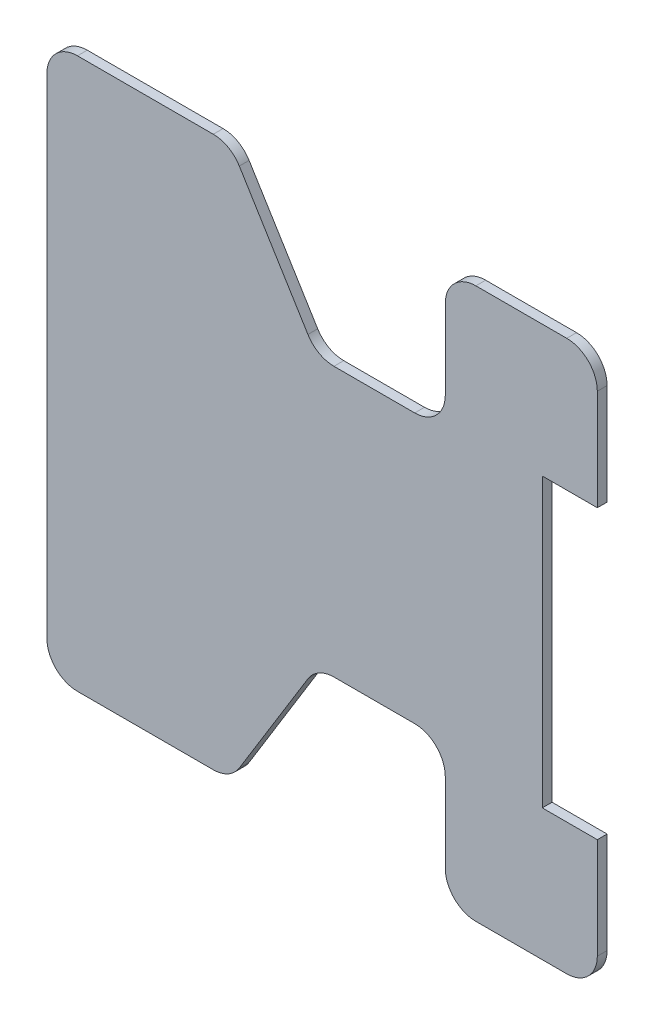
ISO-10303-21;
HEADER;
FILE_DESCRIPTION(('STEP AP214'),'2;1');
FILE_NAME('part.step','',(''),(''),'','','');
FILE_SCHEMA(('AUTOMOTIVE_DESIGN { 1 0 10303 214 1 1 1 1 }'));
ENDSEC;
DATA;
#1=APPLICATION_CONTEXT('core data for automotive mechanical design processes');
#2=APPLICATION_PROTOCOL_DEFINITION('international standard','automotive_design',2000,#1);
#3=PRODUCT_CONTEXT('',#1,'mechanical');
#4=PRODUCT('Part','Part','',(#3));
#5=PRODUCT_RELATED_PRODUCT_CATEGORY('part','',(#4));
#6=PRODUCT_DEFINITION_FORMATION('','',#4);
#7=PRODUCT_DEFINITION_CONTEXT('part definition',#1,'design');
#8=PRODUCT_DEFINITION('design','',#6,#7);
#9=PRODUCT_DEFINITION_SHAPE('','',#8);
#10=(LENGTH_UNIT() NAMED_UNIT(*) SI_UNIT(.MILLI.,.METRE.));
#11=(NAMED_UNIT(*) PLANE_ANGLE_UNIT() SI_UNIT($,.RADIAN.));
#12=(NAMED_UNIT(*) SI_UNIT($,.STERADIAN.) SOLID_ANGLE_UNIT());
#13=UNCERTAINTY_MEASURE_WITH_UNIT(LENGTH_MEASURE(1.E-05),#10,'distance_accuracy_value','');
#14=(GEOMETRIC_REPRESENTATION_CONTEXT(3) GLOBAL_UNCERTAINTY_ASSIGNED_CONTEXT((#13)) GLOBAL_UNIT_ASSIGNED_CONTEXT((#10,
#11,#12)) REPRESENTATION_CONTEXT('',''));
#15=CARTESIAN_POINT('',(0.,0.,0.));
#16=DIRECTION('',(0.,0.,1.));
#17=DIRECTION('',(1.,0.,0.));
#18=AXIS2_PLACEMENT_3D('',#15,#16,#17);
#19=CARTESIAN_POINT('',(0.,0.,1.6));
#20=DIRECTION('',(0.,1.,0.));
#21=DIRECTION('',(0.,0.,1.));
#22=AXIS2_PLACEMENT_3D('',#19,#20,#21);
#23=PLANE('',#22);
#24=DIRECTION('',(1.,0.,0.));
#25=VECTOR('',#24,1.);
#26=CARTESIAN_POINT('',(0.,0.,0.));
#27=LINE('',#26,#25);
#28=CARTESIAN_POINT('',(70.142135623731,0.,0.));
#29=VERTEX_POINT('',#28);
#30=CARTESIAN_POINT('',(85.,0.,0.));
#31=VERTEX_POINT('',#30);
#32=EDGE_CURVE('E278',#29,#31,#27,.T.);
#33=ORIENTED_EDGE('',*,*,#32,.T.);
#34=DIRECTION('',(0.,0.,-1.));
#35=VECTOR('',#34,1.);
#36=CARTESIAN_POINT('',(85.,0.,1.6));
#37=LINE('',#36,#35);
#38=CARTESIAN_POINT('',(85.,0.,1.6));
#39=VERTEX_POINT('',#38);
#40=EDGE_CURVE('E412',#31,#39,#37,.F.);
#41=ORIENTED_EDGE('',*,*,#40,.T.);
#42=DIRECTION('',(1.,0.,0.));
#43=VECTOR('',#42,1.);
#44=CARTESIAN_POINT('',(0.,0.,1.6));
#45=LINE('',#44,#43);
#46=CARTESIAN_POINT('',(70.142135623731,0.,1.6));
#47=VERTEX_POINT('',#46);
#48=EDGE_CURVE('E490',#47,#39,#45,.T.);
#49=ORIENTED_EDGE('',*,*,#48,.F.);
#50=DIRECTION('',(0.,0.,1.));
#51=VECTOR('',#50,1.);
#52=CARTESIAN_POINT('',(70.142135623731,0.,0.));
#53=LINE('',#52,#51);
#54=EDGE_CURVE('E409',#47,#29,#53,.F.);
#55=ORIENTED_EDGE('',*,*,#54,.T.);
#56=EDGE_LOOP('',(#33,#41,#49,#55));
#57=FACE_BOUND('',#56,.T.);
#58=ADVANCED_FACE('F40',(#57),#23,.F.);
#59=CARTESIAN_POINT('',(5.,0.,1.6));
#60=VERTEX_POINT('',#59);
#61=CARTESIAN_POINT('',(27.2048120921154,0.,1.6));
#62=VERTEX_POINT('',#61);
#63=EDGE_CURVE('E238',#60,#62,#45,.T.);
#64=ORIENTED_EDGE('',*,*,#63,.F.);
#65=DIRECTION('',(0.,0.,-1.));
#66=VECTOR('',#65,1.);
#67=CARTESIAN_POINT('',(5.,0.,1.6));
#68=LINE('',#67,#66);
#69=CARTESIAN_POINT('',(5.,0.,0.));
#70=VERTEX_POINT('',#69);
#71=EDGE_CURVE('E377',#60,#70,#68,.T.);
#72=ORIENTED_EDGE('',*,*,#71,.T.);
#73=CARTESIAN_POINT('',(27.2048120921154,0.,0.));
#74=VERTEX_POINT('',#73);
#75=EDGE_CURVE('E280',#70,#74,#27,.T.);
#76=ORIENTED_EDGE('',*,*,#75,.T.);
#77=DIRECTION('',(0.,0.,1.));
#78=VECTOR('',#77,1.);
#79=CARTESIAN_POINT('',(27.2048120921154,0.,1.6));
#80=LINE('',#79,#78);
#81=EDGE_CURVE('E373',#74,#62,#80,.T.);
#82=ORIENTED_EDGE('',*,*,#81,.T.);
#83=EDGE_LOOP('',(#64,#72,#76,#82));
#84=FACE_BOUND('',#83,.T.);
#85=ADVANCED_FACE('F486',(#84),#23,.F.);
#86=CARTESIAN_POINT('',(0.,90.,1.6));
#87=DIRECTION('',(0.,-1.,0.));
#88=DIRECTION('',(0.,0.,-1.));
#89=AXIS2_PLACEMENT_3D('',#86,#87,#88);
#90=PLANE('',#89);
#91=DIRECTION('',(-1.,0.,0.));
#92=VECTOR('',#91,1.);
#93=CARTESIAN_POINT('',(0.,90.,0.));
#94=LINE('',#93,#92);
#95=CARTESIAN_POINT('',(27.2048120921154,90.,0.));
#96=VERTEX_POINT('',#95);
#97=CARTESIAN_POINT('',(5.,90.,0.));
#98=VERTEX_POINT('',#97);
#99=EDGE_CURVE('E299',#96,#98,#94,.T.);
#100=ORIENTED_EDGE('',*,*,#99,.T.);
#101=DIRECTION('',(0.,0.,-1.));
#102=VECTOR('',#101,1.);
#103=CARTESIAN_POINT('',(5.,90.,1.6));
#104=LINE('',#103,#102);
#105=CARTESIAN_POINT('',(5.,90.,1.6));
#106=VERTEX_POINT('',#105);
#107=EDGE_CURVE('E347',#98,#106,#104,.F.);
#108=ORIENTED_EDGE('',*,*,#107,.T.);
#109=DIRECTION('',(-1.,0.,0.));
#110=VECTOR('',#109,1.);
#111=CARTESIAN_POINT('',(0.,90.,1.6));
#112=LINE('',#111,#110);
#113=CARTESIAN_POINT('',(27.2048120921154,90.,1.6));
#114=VERTEX_POINT('',#113);
#115=EDGE_CURVE('E268',#114,#106,#112,.T.);
#116=ORIENTED_EDGE('',*,*,#115,.F.);
#117=DIRECTION('',(0.,0.,1.));
#118=VECTOR('',#117,1.);
#119=CARTESIAN_POINT('',(27.2048120921154,90.,0.));
#120=LINE('',#119,#118);
#121=EDGE_CURVE('E344',#114,#96,#120,.F.);
#122=ORIENTED_EDGE('',*,*,#121,.T.);
#123=EDGE_LOOP('',(#100,#108,#116,#122));
#124=FACE_BOUND('',#123,.T.);
#125=ADVANCED_FACE('F622',(#124),#90,.F.);
#126=CARTESIAN_POINT('',(85.,90.,1.6));
#127=VERTEX_POINT('',#126);
#128=CARTESIAN_POINT('',(70.142135623731,90.,1.6));
#129=VERTEX_POINT('',#128);
#130=EDGE_CURVE('E269',#127,#129,#112,.T.);
#131=ORIENTED_EDGE('',*,*,#130,.F.);
#132=DIRECTION('',(0.,0.,-1.));
#133=VECTOR('',#132,1.);
#134=CARTESIAN_POINT('',(85.,90.,1.6));
#135=LINE('',#134,#133);
#136=CARTESIAN_POINT('',(85.,90.,0.));
#137=VERTEX_POINT('',#136);
#138=EDGE_CURVE('E399',#127,#137,#135,.T.);
#139=ORIENTED_EDGE('',*,*,#138,.T.);
#140=CARTESIAN_POINT('',(70.142135623731,90.,0.));
#141=VERTEX_POINT('',#140);
#142=EDGE_CURVE('E300',#137,#141,#94,.T.);
#143=ORIENTED_EDGE('',*,*,#142,.T.);
#144=DIRECTION('',(0.,0.,1.));
#145=VECTOR('',#144,1.);
#146=CARTESIAN_POINT('',(70.142135623731,90.,1.6));
#147=LINE('',#146,#145);
#148=EDGE_CURVE('E395',#141,#129,#147,.T.);
#149=ORIENTED_EDGE('',*,*,#148,.T.);
#150=EDGE_LOOP('',(#131,#139,#143,#149));
#151=FACE_BOUND('',#150,.T.);
#152=ADVANCED_FACE('F594',(#151),#90,.F.);
#153=CARTESIAN_POINT('',(0.,0.,1.6));
#154=DIRECTION('',(0.,0.,-1.));
#155=DIRECTION('',(-1.,0.,0.));
#156=AXIS2_PLACEMENT_3D('',#153,#154,#155);
#157=PLANE('',#156);
#158=ORIENTED_EDGE('',*,*,#115,.T.);
#159=CARTESIAN_POINT('',(5.,85.,1.6));
#160=DIRECTION('',(0.,0.,-1.));
#161=DIRECTION('',(-1.,0.,0.));
#162=AXIS2_PLACEMENT_3D('',#159,#160,#161);
#163=CIRCLE('',#162,5.);
#164=CARTESIAN_POINT('',(0.,85.,1.6));
#165=VERTEX_POINT('',#164);
#166=EDGE_CURVE('E370',#106,#165,#163,.F.);
#167=ORIENTED_EDGE('',*,*,#166,.T.);
#168=DIRECTION('',(0.,-1.,0.));
#169=VECTOR('',#168,1.);
#170=CARTESIAN_POINT('',(0.,0.,1.6));
#171=LINE('',#170,#169);
#172=CARTESIAN_POINT('',(0.,5.,1.6));
#173=VERTEX_POINT('',#172);
#174=EDGE_CURVE('E304',#165,#173,#171,.T.);
#175=ORIENTED_EDGE('',*,*,#174,.T.);
#176=CARTESIAN_POINT('',(5.,5.,1.6));
#177=DIRECTION('',(0.,0.,-1.));
#178=DIRECTION('',(-1.,0.,0.));
#179=AXIS2_PLACEMENT_3D('',#176,#177,#178);
#180=CIRCLE('',#179,5.);
#181=EDGE_CURVE('E367',#173,#60,#180,.F.);
#182=ORIENTED_EDGE('',*,*,#181,.T.);
#183=ORIENTED_EDGE('',*,*,#63,.T.);
#184=CARTESIAN_POINT('',(27.2048120921154,5.,1.6));
#185=DIRECTION('',(0.,0.,-1.));
#186=DIRECTION('',(-1.,0.,0.));
#187=AXIS2_PLACEMENT_3D('',#184,#185,#186);
#188=CIRCLE('',#187,5.);
#189=CARTESIAN_POINT('',(31.4640713513747,2.38108599560538,1.6));
#190=VERTEX_POINT('',#189);
#191=EDGE_CURVE('E364',#62,#190,#188,.F.);
#192=ORIENTED_EDGE('',*,*,#191,.T.);
#193=DIRECTION('',(0.523782800878925,0.851851851851851,0.));
#194=VECTOR('',#193,1.);
#195=CARTESIAN_POINT('',(44.142135623731,23.,1.6));
#196=LINE('',#195,#194);
#197=CARTESIAN_POINT('',(42.6780642723563,20.6189140043946,1.6));
#198=VERTEX_POINT('',#197);
#199=EDGE_CURVE('E513',#190,#198,#196,.T.);
#200=ORIENTED_EDGE('',*,*,#199,.T.);
#201=CARTESIAN_POINT('',(46.9373235316155,18.,1.6));
#202=DIRECTION('',(0.,0.,-1.));
#203=DIRECTION('',(-1.,0.,0.));
#204=AXIS2_PLACEMENT_3D('',#201,#202,#203);
#205=CIRCLE('',#204,5.);
#206=CARTESIAN_POINT('',(46.9373235316155,23.,1.6));
#207=VERTEX_POINT('',#206);
#208=EDGE_CURVE('E447',#198,#207,#205,.T.);
#209=ORIENTED_EDGE('',*,*,#208,.T.);
#210=DIRECTION('',(1.,0.,0.));
#211=VECTOR('',#210,1.);
#212=CARTESIAN_POINT('',(65.142135623731,23.,1.6));
#213=LINE('',#212,#211);
#214=CARTESIAN_POINT('',(60.142135623731,23.,1.6));
#215=VERTEX_POINT('',#214);
#216=EDGE_CURVE('E509',#207,#215,#213,.T.);
#217=ORIENTED_EDGE('',*,*,#216,.T.);
#218=CARTESIAN_POINT('',(60.142135623731,18.,1.6));
#219=DIRECTION('',(0.,0.,-1.));
#220=DIRECTION('',(-1.,0.,0.));
#221=AXIS2_PLACEMENT_3D('',#218,#219,#220);
#222=CIRCLE('',#221,5.);
#223=CARTESIAN_POINT('',(65.142135623731,18.,1.6));
#224=VERTEX_POINT('',#223);
#225=EDGE_CURVE('E453',#215,#224,#222,.T.);
#226=ORIENTED_EDGE('',*,*,#225,.T.);
#227=DIRECTION('',(0.,-1.,0.));
#228=VECTOR('',#227,1.);
#229=CARTESIAN_POINT('',(65.142135623731,0.,1.6));
#230=LINE('',#229,#228);
#231=CARTESIAN_POINT('',(65.142135623731,5.,1.6));
#232=VERTEX_POINT('',#231);
#233=EDGE_CURVE('E505',#224,#232,#230,.T.);
#234=ORIENTED_EDGE('',*,*,#233,.T.);
#235=CARTESIAN_POINT('',(70.142135623731,5.,1.6));
#236=DIRECTION('',(0.,0.,-1.));
#237=DIRECTION('',(-1.,0.,0.));
#238=AXIS2_PLACEMENT_3D('',#235,#236,#237);
#239=CIRCLE('',#238,5.);
#240=EDGE_CURVE('E353',#232,#47,#239,.F.);
#241=ORIENTED_EDGE('',*,*,#240,.T.);
#242=ORIENTED_EDGE('',*,*,#48,.T.);
#243=CARTESIAN_POINT('',(85.,5.,1.6));
#244=DIRECTION('',(0.,0.,-1.));
#245=DIRECTION('',(-1.,0.,0.));
#246=AXIS2_PLACEMENT_3D('',#243,#244,#245);
#247=CIRCLE('',#246,5.);
#248=CARTESIAN_POINT('',(90.,5.,1.6));
#249=VERTEX_POINT('',#248);
#250=EDGE_CURVE('E233',#39,#249,#247,.F.);
#251=ORIENTED_EDGE('',*,*,#250,.T.);
#252=DIRECTION('',(0.,1.,0.));
#253=VECTOR('',#252,1.);
#254=CARTESIAN_POINT('',(90.,0.,1.6));
#255=LINE('',#254,#253);
#256=CARTESIAN_POINT('',(90.,21.5,1.6));
#257=VERTEX_POINT('',#256);
#258=EDGE_CURVE('E224',#249,#257,#255,.T.);
#259=ORIENTED_EDGE('',*,*,#258,.T.);
#260=DIRECTION('',(-1.,0.,0.));
#261=VECTOR('',#260,1.);
#262=CARTESIAN_POINT('',(90.,21.5,1.6));
#263=LINE('',#262,#261);
#264=CARTESIAN_POINT('',(81.,21.5,1.6));
#265=VERTEX_POINT('',#264);
#266=EDGE_CURVE('E229',#257,#265,#263,.T.);
#267=ORIENTED_EDGE('',*,*,#266,.T.);
#268=DIRECTION('',(0.,1.,0.));
#269=VECTOR('',#268,1.);
#270=CARTESIAN_POINT('',(81.,68.5,1.6));
#271=LINE('',#270,#269);
#272=CARTESIAN_POINT('',(81.,68.5,1.6));
#273=VERTEX_POINT('',#272);
#274=EDGE_CURVE('E255',#265,#273,#271,.T.);
#275=ORIENTED_EDGE('',*,*,#274,.T.);
#276=DIRECTION('',(1.,0.,0.));
#277=VECTOR('',#276,1.);
#278=CARTESIAN_POINT('',(90.,68.5,1.6));
#279=LINE('',#278,#277);
#280=CARTESIAN_POINT('',(90.,68.5,1.6));
#281=VERTEX_POINT('',#280);
#282=EDGE_CURVE('E258',#273,#281,#279,.T.);
#283=ORIENTED_EDGE('',*,*,#282,.T.);
#284=DIRECTION('',(0.,1.,0.));
#285=VECTOR('',#284,1.);
#286=CARTESIAN_POINT('',(90.,68.5,1.6));
#287=LINE('',#286,#285);
#288=CARTESIAN_POINT('',(90.,85.,1.6));
#289=VERTEX_POINT('',#288);
#290=EDGE_CURVE('E264',#281,#289,#287,.T.);
#291=ORIENTED_EDGE('',*,*,#290,.T.);
#292=CARTESIAN_POINT('',(85.,85.,1.6));
#293=DIRECTION('',(0.,0.,-1.));
#294=DIRECTION('',(-1.,0.,0.));
#295=AXIS2_PLACEMENT_3D('',#292,#293,#294);
#296=CIRCLE('',#295,5.);
#297=EDGE_CURVE('E358',#289,#127,#296,.F.);
#298=ORIENTED_EDGE('',*,*,#297,.T.);
#299=ORIENTED_EDGE('',*,*,#130,.T.);
#300=CARTESIAN_POINT('',(70.142135623731,85.,1.6));
#301=DIRECTION('',(0.,0.,-1.));
#302=DIRECTION('',(-1.,0.,0.));
#303=AXIS2_PLACEMENT_3D('',#300,#301,#302);
#304=CIRCLE('',#303,5.);
#305=CARTESIAN_POINT('',(65.142135623731,85.,1.6));
#306=VERTEX_POINT('',#305);
#307=EDGE_CURVE('E350',#129,#306,#304,.F.);
#308=ORIENTED_EDGE('',*,*,#307,.T.);
#309=DIRECTION('',(0.,-1.,0.));
#310=VECTOR('',#309,1.);
#311=CARTESIAN_POINT('',(65.142135623731,67.,1.6));
#312=LINE('',#311,#310);
#313=CARTESIAN_POINT('',(65.142135623731,72.,1.6));
#314=VERTEX_POINT('',#313);
#315=EDGE_CURVE('E502',#306,#314,#312,.T.);
#316=ORIENTED_EDGE('',*,*,#315,.T.);
#317=CARTESIAN_POINT('',(60.142135623731,72.,1.6));
#318=DIRECTION('',(0.,0.,-1.));
#319=DIRECTION('',(-1.,0.,0.));
#320=AXIS2_PLACEMENT_3D('',#317,#318,#319);
#321=CIRCLE('',#320,5.);
#322=CARTESIAN_POINT('',(60.142135623731,67.,1.6));
#323=VERTEX_POINT('',#322);
#324=EDGE_CURVE('E49',#314,#323,#321,.T.);
#325=ORIENTED_EDGE('',*,*,#324,.T.);
#326=DIRECTION('',(-1.,0.,0.));
#327=VECTOR('',#326,1.);
#328=CARTESIAN_POINT('',(44.142135623731,67.,1.6));
#329=LINE('',#328,#327);
#330=CARTESIAN_POINT('',(46.9373235316155,67.,1.6));
#331=VERTEX_POINT('',#330);
#332=EDGE_CURVE('E499',#323,#331,#329,.T.);
#333=ORIENTED_EDGE('',*,*,#332,.T.);
#334=CARTESIAN_POINT('',(46.9373235316155,72.,1.6));
#335=DIRECTION('',(0.,0.,-1.));
#336=DIRECTION('',(-1.,0.,0.));
#337=AXIS2_PLACEMENT_3D('',#334,#335,#336);
#338=CIRCLE('',#337,5.);
#339=CARTESIAN_POINT('',(42.6780642723563,69.3810859956054,1.6));
#340=VERTEX_POINT('',#339);
#341=EDGE_CURVE('E56',#331,#340,#338,.T.);
#342=ORIENTED_EDGE('',*,*,#341,.T.);
#343=DIRECTION('',(-0.523782800878925,0.851851851851851,0.));
#344=VECTOR('',#343,1.);
#345=CARTESIAN_POINT('',(30.,90.,1.6));
#346=LINE('',#345,#344);
#347=CARTESIAN_POINT('',(31.4640713513747,87.6189140043946,1.6));
#348=VERTEX_POINT('',#347);
#349=EDGE_CURVE('E495',#340,#348,#346,.T.);
#350=ORIENTED_EDGE('',*,*,#349,.T.);
#351=CARTESIAN_POINT('',(27.2048120921154,85.,1.6));
#352=DIRECTION('',(0.,0.,-1.));
#353=DIRECTION('',(-1.,0.,0.));
#354=AXIS2_PLACEMENT_3D('',#351,#352,#353);
#355=CIRCLE('',#354,5.);
#356=EDGE_CURVE('E361',#348,#114,#355,.F.);
#357=ORIENTED_EDGE('',*,*,#356,.T.);
#358=EDGE_LOOP('',(#158,#167,#175,#182,#183,#192,#200,#209,#217,#226,#234,#241,#242,#251,#259,
#267,#275,#283,#291,#298,#299,#308,#316,#325,#333,#342,#350,#357));
#359=FACE_BOUND('',#358,.T.);
#360=ADVANCED_FACE('F227',(#359),#157,.F.);
#361=CARTESIAN_POINT('',(0.,0.,0.));
#362=DIRECTION('',(0.,0.,-1.));
#363=DIRECTION('',(-1.,0.,0.));
#364=AXIS2_PLACEMENT_3D('',#361,#362,#363);
#365=PLANE('',#364);
#366=DIRECTION('',(0.,-1.,0.));
#367=VECTOR('',#366,1.);
#368=CARTESIAN_POINT('',(0.,0.,0.));
#369=LINE('',#368,#367);
#370=CARTESIAN_POINT('',(0.,85.,0.));
#371=VERTEX_POINT('',#370);
#372=CARTESIAN_POINT('',(0.,5.,0.));
#373=VERTEX_POINT('',#372);
#374=EDGE_CURVE('E274',#371,#373,#369,.T.);
#375=ORIENTED_EDGE('',*,*,#374,.F.);
#376=CARTESIAN_POINT('',(5.,85.,0.));
#377=DIRECTION('',(0.,0.,-1.));
#378=DIRECTION('',(-1.,0.,0.));
#379=AXIS2_PLACEMENT_3D('',#376,#377,#378);
#380=CIRCLE('',#379,5.);
#381=EDGE_CURVE('E341',#371,#98,#380,.T.);
#382=ORIENTED_EDGE('',*,*,#381,.T.);
#383=ORIENTED_EDGE('',*,*,#99,.F.);
#384=CARTESIAN_POINT('',(27.2048120921154,85.,0.));
#385=DIRECTION('',(0.,0.,-1.));
#386=DIRECTION('',(-1.,0.,0.));
#387=AXIS2_PLACEMENT_3D('',#384,#385,#386);
#388=CIRCLE('',#387,5.);
#389=CARTESIAN_POINT('',(31.4640713513747,87.6189140043946,0.));
#390=VERTEX_POINT('',#389);
#391=EDGE_CURVE('E332',#96,#390,#388,.T.);
#392=ORIENTED_EDGE('',*,*,#391,.T.);
#393=DIRECTION('',(-0.523782800878925,0.851851851851851,0.));
#394=VECTOR('',#393,1.);
#395=CARTESIAN_POINT('',(30.,90.,0.));
#396=LINE('',#395,#394);
#397=CARTESIAN_POINT('',(42.6780642723563,69.3810859956054,0.));
#398=VERTEX_POINT('',#397);
#399=EDGE_CURVE('E279',#398,#390,#396,.T.);
#400=ORIENTED_EDGE('',*,*,#399,.F.);
#401=CARTESIAN_POINT('',(46.9373235316155,72.,0.));
#402=DIRECTION('',(0.,0.,-1.));
#403=DIRECTION('',(-1.,0.,0.));
#404=AXIS2_PLACEMENT_3D('',#401,#402,#403);
#405=CIRCLE('',#404,5.);
#406=CARTESIAN_POINT('',(46.9373235316155,67.,0.));
#407=VERTEX_POINT('',#406);
#408=EDGE_CURVE('E444',#398,#407,#405,.F.);
#409=ORIENTED_EDGE('',*,*,#408,.T.);
#410=DIRECTION('',(-1.,0.,0.));
#411=VECTOR('',#410,1.);
#412=CARTESIAN_POINT('',(44.142135623731,67.,0.));
#413=LINE('',#412,#411);
#414=CARTESIAN_POINT('',(60.142135623731,67.,0.));
#415=VERTEX_POINT('',#414);
#416=EDGE_CURVE('E520',#415,#407,#413,.T.);
#417=ORIENTED_EDGE('',*,*,#416,.F.);
#418=CARTESIAN_POINT('',(60.142135623731,72.,0.));
#419=DIRECTION('',(0.,0.,-1.));
#420=DIRECTION('',(-1.,0.,0.));
#421=AXIS2_PLACEMENT_3D('',#418,#419,#420);
#422=CIRCLE('',#421,5.);
#423=CARTESIAN_POINT('',(65.142135623731,72.,0.));
#424=VERTEX_POINT('',#423);
#425=EDGE_CURVE('E12',#415,#424,#422,.F.);
#426=ORIENTED_EDGE('',*,*,#425,.T.);
#427=DIRECTION('',(0.,-1.,0.));
#428=VECTOR('',#427,1.);
#429=CARTESIAN_POINT('',(65.142135623731,67.,0.));
#430=LINE('',#429,#428);
#431=CARTESIAN_POINT('',(65.142135623731,85.,0.));
#432=VERTEX_POINT('',#431);
#433=EDGE_CURVE('E524',#432,#424,#430,.T.);
#434=ORIENTED_EDGE('',*,*,#433,.F.);
#435=CARTESIAN_POINT('',(70.142135623731,85.,0.));
#436=DIRECTION('',(0.,0.,-1.));
#437=DIRECTION('',(-1.,0.,0.));
#438=AXIS2_PLACEMENT_3D('',#435,#436,#437);
#439=CIRCLE('',#438,5.);
#440=EDGE_CURVE('E320',#432,#141,#439,.T.);
#441=ORIENTED_EDGE('',*,*,#440,.T.);
#442=ORIENTED_EDGE('',*,*,#142,.F.);
#443=CARTESIAN_POINT('',(85.,85.,0.));
#444=DIRECTION('',(0.,0.,-1.));
#445=DIRECTION('',(-1.,0.,0.));
#446=AXIS2_PLACEMENT_3D('',#443,#444,#445);
#447=CIRCLE('',#446,5.);
#448=CARTESIAN_POINT('',(90.,85.,0.));
#449=VERTEX_POINT('',#448);
#450=EDGE_CURVE('E329',#137,#449,#447,.T.);
#451=ORIENTED_EDGE('',*,*,#450,.T.);
#452=DIRECTION('',(0.,1.,0.));
#453=VECTOR('',#452,1.);
#454=CARTESIAN_POINT('',(90.,68.5,0.));
#455=LINE('',#454,#453);
#456=CARTESIAN_POINT('',(90.,68.5,0.));
#457=VERTEX_POINT('',#456);
#458=EDGE_CURVE('E295',#457,#449,#455,.T.);
#459=ORIENTED_EDGE('',*,*,#458,.F.);
#460=DIRECTION('',(1.,0.,0.));
#461=VECTOR('',#460,1.);
#462=CARTESIAN_POINT('',(90.,68.5,0.));
#463=LINE('',#462,#461);
#464=CARTESIAN_POINT('',(81.,68.5,0.));
#465=VERTEX_POINT('',#464);
#466=EDGE_CURVE('E292',#465,#457,#463,.T.);
#467=ORIENTED_EDGE('',*,*,#466,.F.);
#468=DIRECTION('',(0.,1.,0.));
#469=VECTOR('',#468,1.);
#470=CARTESIAN_POINT('',(81.,68.5,0.));
#471=LINE('',#470,#469);
#472=CARTESIAN_POINT('',(81.,21.5,0.));
#473=VERTEX_POINT('',#472);
#474=EDGE_CURVE('E289',#473,#465,#471,.T.);
#475=ORIENTED_EDGE('',*,*,#474,.F.);
#476=DIRECTION('',(-1.,0.,0.));
#477=VECTOR('',#476,1.);
#478=CARTESIAN_POINT('',(90.,21.5,0.));
#479=LINE('',#478,#477);
#480=CARTESIAN_POINT('',(90.,21.5,0.));
#481=VERTEX_POINT('',#480);
#482=EDGE_CURVE('E286',#481,#473,#479,.T.);
#483=ORIENTED_EDGE('',*,*,#482,.F.);
#484=DIRECTION('',(0.,1.,0.));
#485=VECTOR('',#484,1.);
#486=CARTESIAN_POINT('',(90.,0.,0.));
#487=LINE('',#486,#485);
#488=CARTESIAN_POINT('',(90.,5.,0.));
#489=VERTEX_POINT('',#488);
#490=EDGE_CURVE('E244',#489,#481,#487,.T.);
#491=ORIENTED_EDGE('',*,*,#490,.F.);
#492=CARTESIAN_POINT('',(85.,5.,0.));
#493=DIRECTION('',(0.,0.,-1.));
#494=DIRECTION('',(-1.,0.,0.));
#495=AXIS2_PLACEMENT_3D('',#492,#493,#494);
#496=CIRCLE('',#495,5.);
#497=EDGE_CURVE('E326',#489,#31,#496,.T.);
#498=ORIENTED_EDGE('',*,*,#497,.T.);
#499=ORIENTED_EDGE('',*,*,#32,.F.);
#500=CARTESIAN_POINT('',(70.142135623731,5.,0.));
#501=DIRECTION('',(0.,0.,-1.));
#502=DIRECTION('',(-1.,0.,0.));
#503=AXIS2_PLACEMENT_3D('',#500,#501,#502);
#504=CIRCLE('',#503,5.);
#505=CARTESIAN_POINT('',(65.142135623731,5.,0.));
#506=VERTEX_POINT('',#505);
#507=EDGE_CURVE('E323',#29,#506,#504,.T.);
#508=ORIENTED_EDGE('',*,*,#507,.T.);
#509=DIRECTION('',(0.,-1.,0.));
#510=VECTOR('',#509,1.);
#511=CARTESIAN_POINT('',(65.142135623731,0.,0.));
#512=LINE('',#511,#510);
#513=CARTESIAN_POINT('',(65.142135623731,18.,0.));
#514=VERTEX_POINT('',#513);
#515=EDGE_CURVE('E528',#514,#506,#512,.T.);
#516=ORIENTED_EDGE('',*,*,#515,.F.);
#517=CARTESIAN_POINT('',(60.142135623731,18.,0.));
#518=DIRECTION('',(0.,0.,-1.));
#519=DIRECTION('',(-1.,0.,0.));
#520=AXIS2_PLACEMENT_3D('',#517,#518,#519);
#521=CIRCLE('',#520,5.);
#522=CARTESIAN_POINT('',(60.142135623731,23.,0.));
#523=VERTEX_POINT('',#522);
#524=EDGE_CURVE('E456',#514,#523,#521,.F.);
#525=ORIENTED_EDGE('',*,*,#524,.T.);
#526=DIRECTION('',(1.,0.,0.));
#527=VECTOR('',#526,1.);
#528=CARTESIAN_POINT('',(65.142135623731,23.,0.));
#529=LINE('',#528,#527);
#530=CARTESIAN_POINT('',(46.9373235316155,23.,0.));
#531=VERTEX_POINT('',#530);
#532=EDGE_CURVE('E532',#531,#523,#529,.T.);
#533=ORIENTED_EDGE('',*,*,#532,.F.);
#534=CARTESIAN_POINT('',(46.9373235316155,18.,0.));
#535=DIRECTION('',(0.,0.,-1.));
#536=DIRECTION('',(-1.,0.,0.));
#537=AXIS2_PLACEMENT_3D('',#534,#535,#536);
#538=CIRCLE('',#537,5.);
#539=CARTESIAN_POINT('',(42.6780642723563,20.6189140043946,0.));
#540=VERTEX_POINT('',#539);
#541=EDGE_CURVE('E450',#531,#540,#538,.F.);
#542=ORIENTED_EDGE('',*,*,#541,.T.);
#543=DIRECTION('',(0.523782800878925,0.851851851851851,0.));
#544=VECTOR('',#543,1.);
#545=CARTESIAN_POINT('',(44.142135623731,23.,0.));
#546=LINE('',#545,#544);
#547=CARTESIAN_POINT('',(31.4640713513747,2.38108599560538,0.));
#548=VERTEX_POINT('',#547);
#549=EDGE_CURVE('E498',#548,#540,#546,.T.);
#550=ORIENTED_EDGE('',*,*,#549,.F.);
#551=CARTESIAN_POINT('',(27.2048120921154,5.,0.));
#552=DIRECTION('',(0.,0.,-1.));
#553=DIRECTION('',(-1.,0.,0.));
#554=AXIS2_PLACEMENT_3D('',#551,#552,#553);
#555=CIRCLE('',#554,5.);
#556=EDGE_CURVE('E335',#548,#74,#555,.T.);
#557=ORIENTED_EDGE('',*,*,#556,.T.);
#558=ORIENTED_EDGE('',*,*,#75,.F.);
#559=CARTESIAN_POINT('',(5.,5.,0.));
#560=DIRECTION('',(0.,0.,-1.));
#561=DIRECTION('',(-1.,0.,0.));
#562=AXIS2_PLACEMENT_3D('',#559,#560,#561);
#563=CIRCLE('',#562,5.);
#564=EDGE_CURVE('E338',#70,#373,#563,.T.);
#565=ORIENTED_EDGE('',*,*,#564,.T.);
#566=EDGE_LOOP('',(#375,#382,#383,#392,#400,#409,#417,#426,#434,#441,#442,#451,#459,#467,#475,
#483,#491,#498,#499,#508,#516,#525,#533,#542,#550,#557,#558,#565));
#567=FACE_BOUND('',#566,.T.);
#568=ADVANCED_FACE('F476',(#567),#365,.T.);
#569=CARTESIAN_POINT('',(0.,0.,1.6));
#570=DIRECTION('',(1.,0.,0.));
#571=DIRECTION('',(0.,0.,-1.));
#572=AXIS2_PLACEMENT_3D('',#569,#570,#571);
#573=PLANE('',#572);
#574=ORIENTED_EDGE('',*,*,#174,.F.);
#575=DIRECTION('',(0.,0.,-1.));
#576=VECTOR('',#575,1.);
#577=CARTESIAN_POINT('',(0.,85.,1.6));
#578=LINE('',#577,#576);
#579=EDGE_CURVE('E316',#165,#371,#578,.T.);
#580=ORIENTED_EDGE('',*,*,#579,.T.);
#581=ORIENTED_EDGE('',*,*,#374,.T.);
#582=DIRECTION('',(0.,0.,-1.));
#583=VECTOR('',#582,1.);
#584=CARTESIAN_POINT('',(0.,5.,1.6));
#585=LINE('',#584,#583);
#586=EDGE_CURVE('E248',#373,#173,#585,.F.);
#587=ORIENTED_EDGE('',*,*,#586,.T.);
#588=EDGE_LOOP('',(#574,#580,#581,#587));
#589=FACE_BOUND('',#588,.T.);
#590=ADVANCED_FACE('F473',(#589),#573,.F.);
#591=CARTESIAN_POINT('',(90.,0.,1.6));
#592=DIRECTION('',(-1.,0.,0.));
#593=DIRECTION('',(0.,0.,1.));
#594=AXIS2_PLACEMENT_3D('',#591,#592,#593);
#595=PLANE('',#594);
#596=ORIENTED_EDGE('',*,*,#258,.F.);
#597=DIRECTION('',(0.,0.,-1.));
#598=VECTOR('',#597,1.);
#599=CARTESIAN_POINT('',(90.,5.,1.6));
#600=LINE('',#599,#598);
#601=EDGE_CURVE('E406',#249,#489,#600,.T.);
#602=ORIENTED_EDGE('',*,*,#601,.T.);
#603=ORIENTED_EDGE('',*,*,#490,.T.);
#604=DIRECTION('',(0.,0.,-1.));
#605=VECTOR('',#604,1.);
#606=CARTESIAN_POINT('',(90.,21.5,1.6));
#607=LINE('',#606,#605);
#608=EDGE_CURVE('E241',#257,#481,#607,.T.);
#609=ORIENTED_EDGE('',*,*,#608,.F.);
#610=EDGE_LOOP('',(#596,#602,#603,#609));
#611=FACE_BOUND('',#610,.T.);
#612=ADVANCED_FACE('F242',(#611),#595,.F.);
#613=CARTESIAN_POINT('',(90.,21.5,1.6));
#614=DIRECTION('',(0.,-1.,0.));
#615=DIRECTION('',(0.,0.,-1.));
#616=AXIS2_PLACEMENT_3D('',#613,#614,#615);
#617=PLANE('',#616);
#618=ORIENTED_EDGE('',*,*,#482,.T.);
#619=DIRECTION('',(0.,0.,-1.));
#620=VECTOR('',#619,1.);
#621=CARTESIAN_POINT('',(81.,21.5,1.6));
#622=LINE('',#621,#620);
#623=EDGE_CURVE('E249',#265,#473,#622,.T.);
#624=ORIENTED_EDGE('',*,*,#623,.F.);
#625=ORIENTED_EDGE('',*,*,#266,.F.);
#626=ORIENTED_EDGE('',*,*,#608,.T.);
#627=EDGE_LOOP('',(#618,#624,#625,#626));
#628=FACE_BOUND('',#627,.T.);
#629=ADVANCED_FACE('F251',(#628),#617,.F.);
#630=CARTESIAN_POINT('',(81.,68.5,1.6));
#631=DIRECTION('',(-1.,0.,0.));
#632=DIRECTION('',(0.,0.,1.));
#633=AXIS2_PLACEMENT_3D('',#630,#631,#632);
#634=PLANE('',#633);
#635=ORIENTED_EDGE('',*,*,#474,.T.);
#636=DIRECTION('',(0.,0.,-1.));
#637=VECTOR('',#636,1.);
#638=CARTESIAN_POINT('',(81.,68.5,1.6));
#639=LINE('',#638,#637);
#640=EDGE_CURVE('E308',#273,#465,#639,.T.);
#641=ORIENTED_EDGE('',*,*,#640,.F.);
#642=ORIENTED_EDGE('',*,*,#274,.F.);
#643=ORIENTED_EDGE('',*,*,#623,.T.);
#644=EDGE_LOOP('',(#635,#641,#642,#643));
#645=FACE_BOUND('',#644,.T.);
#646=ADVANCED_FACE('F577',(#645),#634,.F.);
#647=CARTESIAN_POINT('',(90.,68.5,1.6));
#648=DIRECTION('',(0.,1.,0.));
#649=DIRECTION('',(0.,0.,1.));
#650=AXIS2_PLACEMENT_3D('',#647,#648,#649);
#651=PLANE('',#650);
#652=ORIENTED_EDGE('',*,*,#466,.T.);
#653=DIRECTION('',(0.,0.,-1.));
#654=VECTOR('',#653,1.);
#655=CARTESIAN_POINT('',(90.,68.5,1.6));
#656=LINE('',#655,#654);
#657=EDGE_CURVE('E273',#281,#457,#656,.T.);
#658=ORIENTED_EDGE('',*,*,#657,.F.);
#659=ORIENTED_EDGE('',*,*,#282,.F.);
#660=ORIENTED_EDGE('',*,*,#640,.T.);
#661=EDGE_LOOP('',(#652,#658,#659,#660));
#662=FACE_BOUND('',#661,.T.);
#663=ADVANCED_FACE('F584',(#662),#651,.F.);
#664=CARTESIAN_POINT('',(90.,68.5,1.6));
#665=DIRECTION('',(-1.,0.,0.));
#666=DIRECTION('',(0.,0.,1.));
#667=AXIS2_PLACEMENT_3D('',#664,#665,#666);
#668=PLANE('',#667);
#669=ORIENTED_EDGE('',*,*,#458,.T.);
#670=DIRECTION('',(0.,0.,-1.));
#671=VECTOR('',#670,1.);
#672=CARTESIAN_POINT('',(90.,85.,1.6));
#673=LINE('',#672,#671);
#674=EDGE_CURVE('E403',#449,#289,#673,.F.);
#675=ORIENTED_EDGE('',*,*,#674,.T.);
#676=ORIENTED_EDGE('',*,*,#290,.F.);
#677=ORIENTED_EDGE('',*,*,#657,.T.);
#678=EDGE_LOOP('',(#669,#675,#676,#677));
#679=FACE_BOUND('',#678,.T.);
#680=ADVANCED_FACE('F587',(#679),#668,.F.);
#681=CARTESIAN_POINT('',(44.142135623731,23.,0.));
#682=DIRECTION('',(0.851851851851851,-0.523782800878925,0.));
#683=DIRECTION('',(0.523782800878925,0.851851851851852,0.));
#684=AXIS2_PLACEMENT_3D('',#681,#682,#683);
#685=PLANE('',#684);
#686=ORIENTED_EDGE('',*,*,#199,.F.);
#687=DIRECTION('',(0.,0.,1.));
#688=VECTOR('',#687,1.);
#689=CARTESIAN_POINT('',(31.4640713513747,2.38108599560538,0.));
#690=LINE('',#689,#688);
#691=EDGE_CURVE('E385',#190,#548,#690,.F.);
#692=ORIENTED_EDGE('',*,*,#691,.T.);
#693=ORIENTED_EDGE('',*,*,#549,.T.);
#694=DIRECTION('',(0.,0.,1.));
#695=VECTOR('',#694,1.);
#696=CARTESIAN_POINT('',(42.6780642723563,20.6189140043946,1.6));
#697=LINE('',#696,#695);
#698=EDGE_CURVE('E381',#540,#198,#697,.T.);
#699=ORIENTED_EDGE('',*,*,#698,.T.);
#700=EDGE_LOOP('',(#686,#692,#693,#699));
#701=FACE_BOUND('',#700,.T.);
#702=ADVANCED_FACE('F542',(#701),#685,.T.);
#703=CARTESIAN_POINT('',(65.142135623731,23.,0.));
#704=DIRECTION('',(0.,-1.,0.));
#705=DIRECTION('',(1.,0.,0.));
#706=AXIS2_PLACEMENT_3D('',#703,#704,#705);
#707=PLANE('',#706);
#708=ORIENTED_EDGE('',*,*,#216,.F.);
#709=DIRECTION('',(0.,0.,1.));
#710=VECTOR('',#709,1.);
#711=CARTESIAN_POINT('',(46.9373235316155,23.,0.));
#712=LINE('',#711,#710);
#713=EDGE_CURVE('E425',#207,#531,#712,.F.);
#714=ORIENTED_EDGE('',*,*,#713,.T.);
#715=ORIENTED_EDGE('',*,*,#532,.T.);
#716=DIRECTION('',(0.,0.,1.));
#717=VECTOR('',#716,1.);
#718=CARTESIAN_POINT('',(60.142135623731,23.,1.6));
#719=LINE('',#718,#717);
#720=EDGE_CURVE('E421',#523,#215,#719,.T.);
#721=ORIENTED_EDGE('',*,*,#720,.T.);
#722=EDGE_LOOP('',(#708,#714,#715,#721));
#723=FACE_BOUND('',#722,.T.);
#724=ADVANCED_FACE('F551',(#723),#707,.T.);
#725=CARTESIAN_POINT('',(65.142135623731,0.,0.));
#726=DIRECTION('',(-1.,0.,0.));
#727=DIRECTION('',(0.,0.,1.));
#728=AXIS2_PLACEMENT_3D('',#725,#726,#727);
#729=PLANE('',#728);
#730=ORIENTED_EDGE('',*,*,#515,.T.);
#731=DIRECTION('',(0.,0.,1.));
#732=VECTOR('',#731,1.);
#733=CARTESIAN_POINT('',(65.142135623731,5.,1.6));
#734=LINE('',#733,#732);
#735=EDGE_CURVE('E431',#506,#232,#734,.T.);
#736=ORIENTED_EDGE('',*,*,#735,.T.);
#737=ORIENTED_EDGE('',*,*,#233,.F.);
#738=DIRECTION('',(0.,0.,1.));
#739=VECTOR('',#738,1.);
#740=CARTESIAN_POINT('',(65.142135623731,18.,0.));
#741=LINE('',#740,#739);
#742=EDGE_CURVE('E428',#224,#514,#741,.F.);
#743=ORIENTED_EDGE('',*,*,#742,.T.);
#744=EDGE_LOOP('',(#730,#736,#737,#743));
#745=FACE_BOUND('',#744,.T.);
#746=ADVANCED_FACE('F560',(#745),#729,.T.);
#747=CARTESIAN_POINT('',(30.,90.,0.));
#748=DIRECTION('',(0.851851851851851,0.523782800878925,0.));
#749=DIRECTION('',(-0.523782800878925,0.851851851851852,0.));
#750=AXIS2_PLACEMENT_3D('',#747,#748,#749);
#751=PLANE('',#750);
#752=ORIENTED_EDGE('',*,*,#399,.T.);
#753=DIRECTION('',(0.,0.,1.));
#754=VECTOR('',#753,1.);
#755=CARTESIAN_POINT('',(31.4640713513747,87.6189140043946,1.6));
#756=LINE('',#755,#754);
#757=EDGE_CURVE('E391',#390,#348,#756,.T.);
#758=ORIENTED_EDGE('',*,*,#757,.T.);
#759=ORIENTED_EDGE('',*,*,#349,.F.);
#760=DIRECTION('',(0.,0.,1.));
#761=VECTOR('',#760,1.);
#762=CARTESIAN_POINT('',(42.6780642723563,69.3810859956054,0.));
#763=LINE('',#762,#761);
#764=EDGE_CURVE('E388',#340,#398,#763,.F.);
#765=ORIENTED_EDGE('',*,*,#764,.T.);
#766=EDGE_LOOP('',(#752,#758,#759,#765));
#767=FACE_BOUND('',#766,.T.);
#768=ADVANCED_FACE('F617',(#767),#751,.T.);
#769=CARTESIAN_POINT('',(44.142135623731,67.,0.));
#770=DIRECTION('',(0.,1.,0.));
#771=DIRECTION('',(0.,0.,1.));
#772=AXIS2_PLACEMENT_3D('',#769,#770,#771);
#773=PLANE('',#772);
#774=ORIENTED_EDGE('',*,*,#416,.T.);
#775=DIRECTION('',(0.,0.,1.));
#776=VECTOR('',#775,1.);
#777=CARTESIAN_POINT('',(46.9373235316155,67.,1.6));
#778=LINE('',#777,#776);
#779=EDGE_CURVE('E418',#407,#331,#778,.T.);
#780=ORIENTED_EDGE('',*,*,#779,.T.);
#781=ORIENTED_EDGE('',*,*,#332,.F.);
#782=DIRECTION('',(0.,0.,1.));
#783=VECTOR('',#782,1.);
#784=CARTESIAN_POINT('',(60.142135623731,67.,0.));
#785=LINE('',#784,#783);
#786=EDGE_CURVE('E415',#323,#415,#785,.F.);
#787=ORIENTED_EDGE('',*,*,#786,.T.);
#788=EDGE_LOOP('',(#774,#780,#781,#787));
#789=FACE_BOUND('',#788,.T.);
#790=ADVANCED_FACE('F611',(#789),#773,.T.);
#791=CARTESIAN_POINT('',(65.142135623731,67.,0.));
#792=DIRECTION('',(-1.,0.,0.));
#793=DIRECTION('',(0.,0.,1.));
#794=AXIS2_PLACEMENT_3D('',#791,#792,#793);
#795=PLANE('',#794);
#796=ORIENTED_EDGE('',*,*,#433,.T.);
#797=DIRECTION('',(0.,0.,1.));
#798=VECTOR('',#797,1.);
#799=CARTESIAN_POINT('',(65.142135623731,72.,1.6));
#800=LINE('',#799,#798);
#801=EDGE_CURVE('E438',#424,#314,#800,.T.);
#802=ORIENTED_EDGE('',*,*,#801,.T.);
#803=ORIENTED_EDGE('',*,*,#315,.F.);
#804=DIRECTION('',(0.,0.,1.));
#805=VECTOR('',#804,1.);
#806=CARTESIAN_POINT('',(65.142135623731,85.,0.));
#807=LINE('',#806,#805);
#808=EDGE_CURVE('E435',#306,#432,#807,.F.);
#809=ORIENTED_EDGE('',*,*,#808,.T.);
#810=EDGE_LOOP('',(#796,#802,#803,#809));
#811=FACE_BOUND('',#810,.T.);
#812=ADVANCED_FACE('F602',(#811),#795,.T.);
#813=CARTESIAN_POINT('',(5.,85.,1.6));
#814=DIRECTION('',(0.,0.,-1.));
#815=DIRECTION('',(-1.,0.,0.));
#816=AXIS2_PLACEMENT_3D('',#813,#814,#815);
#817=CYLINDRICAL_SURFACE('',#816,5.);
#818=ORIENTED_EDGE('',*,*,#166,.F.);
#819=ORIENTED_EDGE('',*,*,#107,.F.);
#820=ORIENTED_EDGE('',*,*,#381,.F.);
#821=ORIENTED_EDGE('',*,*,#579,.F.);
#822=EDGE_LOOP('',(#818,#819,#820,#821));
#823=FACE_BOUND('',#822,.T.);
#824=ADVANCED_FACE('F470',(#823),#817,.T.);
#825=CARTESIAN_POINT('',(5.,5.,1.6));
#826=DIRECTION('',(0.,0.,-1.));
#827=DIRECTION('',(-1.,0.,0.));
#828=AXIS2_PLACEMENT_3D('',#825,#826,#827);
#829=CYLINDRICAL_SURFACE('',#828,5.);
#830=ORIENTED_EDGE('',*,*,#181,.F.);
#831=ORIENTED_EDGE('',*,*,#586,.F.);
#832=ORIENTED_EDGE('',*,*,#564,.F.);
#833=ORIENTED_EDGE('',*,*,#71,.F.);
#834=EDGE_LOOP('',(#830,#831,#832,#833));
#835=FACE_BOUND('',#834,.T.);
#836=ADVANCED_FACE('F483',(#835),#829,.T.);
#837=CARTESIAN_POINT('',(27.2048120921154,5.,1.6));
#838=DIRECTION('',(0.,0.,-1.));
#839=DIRECTION('',(-1.,0.,0.));
#840=AXIS2_PLACEMENT_3D('',#837,#838,#839);
#841=CYLINDRICAL_SURFACE('',#840,5.);
#842=ORIENTED_EDGE('',*,*,#556,.F.);
#843=ORIENTED_EDGE('',*,*,#691,.F.);
#844=ORIENTED_EDGE('',*,*,#191,.F.);
#845=ORIENTED_EDGE('',*,*,#81,.F.);
#846=EDGE_LOOP('',(#842,#843,#844,#845));
#847=FACE_BOUND('',#846,.T.);
#848=ADVANCED_FACE('F646',(#847),#841,.T.);
#849=CARTESIAN_POINT('',(27.2048120921154,85.,0.));
#850=DIRECTION('',(0.,0.,-1.));
#851=DIRECTION('',(-1.,0.,0.));
#852=AXIS2_PLACEMENT_3D('',#849,#850,#851);
#853=CYLINDRICAL_SURFACE('',#852,5.);
#854=ORIENTED_EDGE('',*,*,#391,.F.);
#855=ORIENTED_EDGE('',*,*,#121,.F.);
#856=ORIENTED_EDGE('',*,*,#356,.F.);
#857=ORIENTED_EDGE('',*,*,#757,.F.);
#858=EDGE_LOOP('',(#854,#855,#856,#857));
#859=FACE_BOUND('',#858,.T.);
#860=ADVANCED_FACE('F621',(#859),#853,.T.);
#861=CARTESIAN_POINT('',(85.,85.,1.6));
#862=DIRECTION('',(0.,0.,-1.));
#863=DIRECTION('',(-1.,0.,0.));
#864=AXIS2_PLACEMENT_3D('',#861,#862,#863);
#865=CYLINDRICAL_SURFACE('',#864,5.);
#866=ORIENTED_EDGE('',*,*,#297,.F.);
#867=ORIENTED_EDGE('',*,*,#674,.F.);
#868=ORIENTED_EDGE('',*,*,#450,.F.);
#869=ORIENTED_EDGE('',*,*,#138,.F.);
#870=EDGE_LOOP('',(#866,#867,#868,#869));
#871=FACE_BOUND('',#870,.T.);
#872=ADVANCED_FACE('F590',(#871),#865,.T.);
#873=CARTESIAN_POINT('',(85.,5.,1.6));
#874=DIRECTION('',(0.,0.,-1.));
#875=DIRECTION('',(-1.,0.,0.));
#876=AXIS2_PLACEMENT_3D('',#873,#874,#875);
#877=CYLINDRICAL_SURFACE('',#876,5.);
#878=ORIENTED_EDGE('',*,*,#250,.F.);
#879=ORIENTED_EDGE('',*,*,#40,.F.);
#880=ORIENTED_EDGE('',*,*,#497,.F.);
#881=ORIENTED_EDGE('',*,*,#601,.F.);
#882=EDGE_LOOP('',(#878,#879,#880,#881));
#883=FACE_BOUND('',#882,.T.);
#884=ADVANCED_FACE('F573',(#883),#877,.T.);
#885=CARTESIAN_POINT('',(46.9373235316155,72.,0.));
#886=DIRECTION('',(0.,0.,-1.));
#887=DIRECTION('',(-1.,0.,0.));
#888=AXIS2_PLACEMENT_3D('',#885,#886,#887);
#889=CYLINDRICAL_SURFACE('',#888,5.);
#890=ORIENTED_EDGE('',*,*,#408,.F.);
#891=ORIENTED_EDGE('',*,*,#764,.F.);
#892=ORIENTED_EDGE('',*,*,#341,.F.);
#893=ORIENTED_EDGE('',*,*,#779,.F.);
#894=EDGE_LOOP('',(#890,#891,#892,#893));
#895=FACE_BOUND('',#894,.T.);
#896=ADVANCED_FACE('F614',(#895),#889,.F.);
#897=CARTESIAN_POINT('',(46.9373235316155,18.,0.));
#898=DIRECTION('',(0.,0.,-1.));
#899=DIRECTION('',(-1.,0.,0.));
#900=AXIS2_PLACEMENT_3D('',#897,#898,#899);
#901=CYLINDRICAL_SURFACE('',#900,5.);
#902=ORIENTED_EDGE('',*,*,#541,.F.);
#903=ORIENTED_EDGE('',*,*,#713,.F.);
#904=ORIENTED_EDGE('',*,*,#208,.F.);
#905=ORIENTED_EDGE('',*,*,#698,.F.);
#906=EDGE_LOOP('',(#902,#903,#904,#905));
#907=FACE_BOUND('',#906,.T.);
#908=ADVANCED_FACE('F547',(#907),#901,.F.);
#909=CARTESIAN_POINT('',(70.142135623731,5.,0.));
#910=DIRECTION('',(0.,0.,-1.));
#911=DIRECTION('',(-1.,0.,0.));
#912=AXIS2_PLACEMENT_3D('',#909,#910,#911);
#913=CYLINDRICAL_SURFACE('',#912,5.);
#914=ORIENTED_EDGE('',*,*,#507,.F.);
#915=ORIENTED_EDGE('',*,*,#54,.F.);
#916=ORIENTED_EDGE('',*,*,#240,.F.);
#917=ORIENTED_EDGE('',*,*,#735,.F.);
#918=EDGE_LOOP('',(#914,#915,#916,#917));
#919=FACE_BOUND('',#918,.T.);
#920=ADVANCED_FACE('F565',(#919),#913,.T.);
#921=CARTESIAN_POINT('',(60.142135623731,18.,0.));
#922=DIRECTION('',(0.,0.,-1.));
#923=DIRECTION('',(-1.,0.,0.));
#924=AXIS2_PLACEMENT_3D('',#921,#922,#923);
#925=CYLINDRICAL_SURFACE('',#924,5.);
#926=ORIENTED_EDGE('',*,*,#524,.F.);
#927=ORIENTED_EDGE('',*,*,#742,.F.);
#928=ORIENTED_EDGE('',*,*,#225,.F.);
#929=ORIENTED_EDGE('',*,*,#720,.F.);
#930=EDGE_LOOP('',(#926,#927,#928,#929));
#931=FACE_BOUND('',#930,.T.);
#932=ADVANCED_FACE('F556',(#931),#925,.F.);
#933=CARTESIAN_POINT('',(60.142135623731,72.,0.));
#934=DIRECTION('',(0.,0.,-1.));
#935=DIRECTION('',(-1.,0.,0.));
#936=AXIS2_PLACEMENT_3D('',#933,#934,#935);
#937=CYLINDRICAL_SURFACE('',#936,5.);
#938=ORIENTED_EDGE('',*,*,#425,.F.);
#939=ORIENTED_EDGE('',*,*,#786,.F.);
#940=ORIENTED_EDGE('',*,*,#324,.F.);
#941=ORIENTED_EDGE('',*,*,#801,.F.);
#942=EDGE_LOOP('',(#938,#939,#940,#941));
#943=FACE_BOUND('',#942,.T.);
#944=ADVANCED_FACE('F607',(#943),#937,.F.);
#945=CARTESIAN_POINT('',(70.142135623731,85.,1.6));
#946=DIRECTION('',(0.,0.,-1.));
#947=DIRECTION('',(-1.,0.,0.));
#948=AXIS2_PLACEMENT_3D('',#945,#946,#947);
#949=CYLINDRICAL_SURFACE('',#948,5.);
#950=ORIENTED_EDGE('',*,*,#440,.F.);
#951=ORIENTED_EDGE('',*,*,#808,.F.);
#952=ORIENTED_EDGE('',*,*,#307,.F.);
#953=ORIENTED_EDGE('',*,*,#148,.F.);
#954=EDGE_LOOP('',(#950,#951,#952,#953));
#955=FACE_BOUND('',#954,.T.);
#956=ADVANCED_FACE('F42',(#955),#949,.T.);
#957=CLOSED_SHELL('',(#58,#85,#125,#152,#360,#568,#590,#612,#629,#646,#663,#680,#702,#724,#746,
#768,#790,#812,#824,#836,#848,#860,#872,#884,#896,#908,#920,#932,#944,#956));
#958=MANIFOLD_SOLID_BREP('B2',#957);
#959=ADVANCED_BREP_SHAPE_REPRESENTATION('',(#18,#958),#14);
#960=SHAPE_DEFINITION_REPRESENTATION(#9,#959);
ENDSEC;
END-ISO-10303-21;
